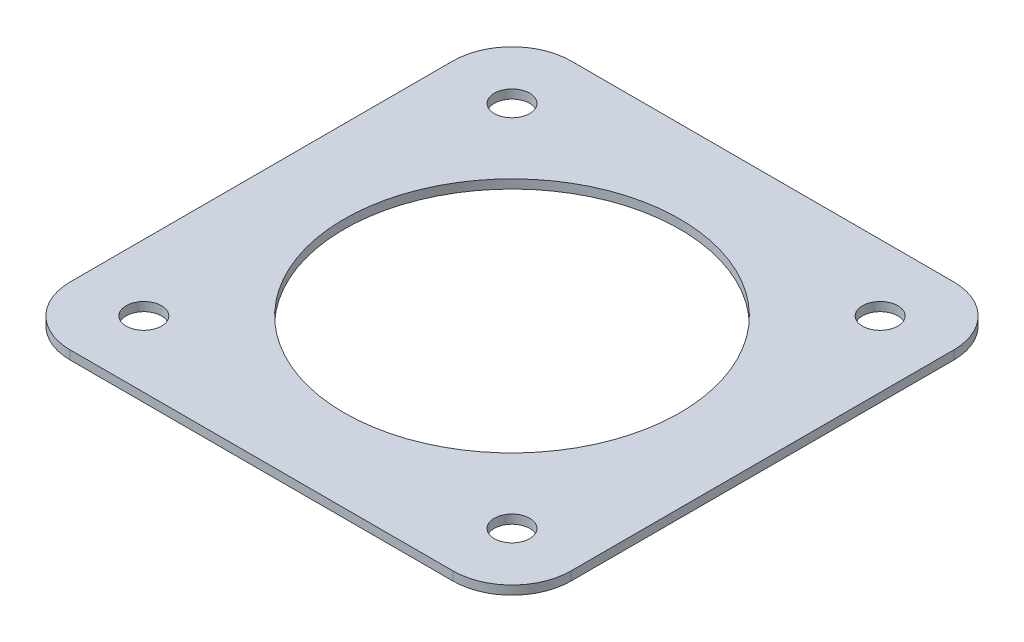
ISO-10303-21;
HEADER;
FILE_DESCRIPTION(('STEP AP214'),'2;1');
FILE_NAME('part.step','',(''),(''),'','','');
FILE_SCHEMA(('AUTOMOTIVE_DESIGN { 1 0 10303 214 1 1 1 1 }'));
ENDSEC;
DATA;
#1=APPLICATION_CONTEXT('core data for automotive mechanical design processes');
#2=APPLICATION_PROTOCOL_DEFINITION('international standard','automotive_design',2000,#1);
#3=PRODUCT_CONTEXT('',#1,'mechanical');
#4=PRODUCT('Part','Part','',(#3));
#5=PRODUCT_RELATED_PRODUCT_CATEGORY('part','',(#4));
#6=PRODUCT_DEFINITION_FORMATION('','',#4);
#7=PRODUCT_DEFINITION_CONTEXT('part definition',#1,'design');
#8=PRODUCT_DEFINITION('design','',#6,#7);
#9=PRODUCT_DEFINITION_SHAPE('','',#8);
#10=(LENGTH_UNIT() NAMED_UNIT(*) SI_UNIT(.MILLI.,.METRE.));
#11=(NAMED_UNIT(*) PLANE_ANGLE_UNIT() SI_UNIT($,.RADIAN.));
#12=(NAMED_UNIT(*) SI_UNIT($,.STERADIAN.) SOLID_ANGLE_UNIT());
#13=UNCERTAINTY_MEASURE_WITH_UNIT(LENGTH_MEASURE(1.E-05),#10,'distance_accuracy_value','');
#14=(GEOMETRIC_REPRESENTATION_CONTEXT(3) GLOBAL_UNCERTAINTY_ASSIGNED_CONTEXT((#13)) GLOBAL_UNIT_ASSIGNED_CONTEXT((#10,
#11,#12)) REPRESENTATION_CONTEXT('',''));
#15=CARTESIAN_POINT('',(0.,0.,0.));
#16=DIRECTION('',(0.,0.,1.));
#17=DIRECTION('',(1.,0.,0.));
#18=AXIS2_PLACEMENT_3D('',#15,#16,#17);
#19=CARTESIAN_POINT('',(-65.,3.,65.));
#20=DIRECTION('',(0.,1.,0.));
#21=DIRECTION('',(0.,0.,1.));
#22=AXIS2_PLACEMENT_3D('',#19,#20,#21);
#23=PLANE('',#22);
#24=CARTESIAN_POINT('',(62.5,3.,-62.5000000000001));
#25=DIRECTION('',(0.,1.,0.));
#26=DIRECTION('',(0.,0.,1.));
#27=AXIS2_PLACEMENT_3D('',#24,#25,#26);
#28=CIRCLE('',#27,6.);
#29=CARTESIAN_POINT('',(62.5,3.,-56.5));
#30=VERTEX_POINT('',#29);
#31=EDGE_CURVE('E196',#30,#30,#28,.T.);
#32=ORIENTED_EDGE('',*,*,#31,.F.);
#33=EDGE_LOOP('',(#32));
#34=FACE_BOUND('',#33,.T.);
#35=CARTESIAN_POINT('',(0.,3.,0.));
#36=DIRECTION('',(0.,1.,0.));
#37=DIRECTION('',(0.,0.,1.));
#38=AXIS2_PLACEMENT_3D('',#35,#36,#37);
#39=CIRCLE('',#38,57.);
#40=CARTESIAN_POINT('',(0.,3.,57.));
#41=VERTEX_POINT('',#40);
#42=EDGE_CURVE('E184',#41,#41,#39,.T.);
#43=ORIENTED_EDGE('',*,*,#42,.F.);
#44=EDGE_LOOP('',(#43));
#45=FACE_BOUND('',#44,.T.);
#46=CARTESIAN_POINT('',(-65.,3.,65.));
#47=DIRECTION('',(0.,1.,0.));
#48=DIRECTION('',(0.,0.,1.));
#49=AXIS2_PLACEMENT_3D('',#46,#47,#48);
#50=CIRCLE('',#49,20.);
#51=CARTESIAN_POINT('',(-85.,3.,64.9999999999999));
#52=VERTEX_POINT('',#51);
#53=CARTESIAN_POINT('',(-64.9999999999998,3.,85.));
#54=VERTEX_POINT('',#53);
#55=EDGE_CURVE('E147',#52,#54,#50,.T.);
#56=ORIENTED_EDGE('',*,*,#55,.T.);
#57=DIRECTION('',(1.,0.,0.));
#58=VECTOR('',#57,1.);
#59=CARTESIAN_POINT('',(64.9999999999999,3.,85.));
#60=LINE('',#59,#58);
#61=CARTESIAN_POINT('',(64.9999999999999,3.,85.));
#62=VERTEX_POINT('',#61);
#63=EDGE_CURVE('E95',#54,#62,#60,.T.);
#64=ORIENTED_EDGE('',*,*,#63,.T.);
#65=CARTESIAN_POINT('',(65.,3.,65.));
#66=DIRECTION('',(0.,1.,0.));
#67=DIRECTION('',(0.,0.,1.));
#68=AXIS2_PLACEMENT_3D('',#65,#66,#67);
#69=CIRCLE('',#68,20.);
#70=CARTESIAN_POINT('',(85.,3.,64.9999999999999));
#71=VERTEX_POINT('',#70);
#72=EDGE_CURVE('E162',#62,#71,#69,.T.);
#73=ORIENTED_EDGE('',*,*,#72,.T.);
#74=DIRECTION('',(0.,0.,-1.));
#75=VECTOR('',#74,1.);
#76=CARTESIAN_POINT('',(85.,3.,64.9999999999999));
#77=LINE('',#76,#75);
#78=CARTESIAN_POINT('',(85.,3.,-64.9999999999999));
#79=VERTEX_POINT('',#78);
#80=EDGE_CURVE('E175',#71,#79,#77,.T.);
#81=ORIENTED_EDGE('',*,*,#80,.T.);
#82=CARTESIAN_POINT('',(65.,3.,-65.));
#83=DIRECTION('',(0.,1.,0.));
#84=DIRECTION('',(0.,0.,1.));
#85=AXIS2_PLACEMENT_3D('',#82,#83,#84);
#86=CIRCLE('',#85,20.);
#87=CARTESIAN_POINT('',(64.9999999999999,3.,-85.));
#88=VERTEX_POINT('',#87);
#89=EDGE_CURVE('E114',#79,#88,#86,.T.);
#90=ORIENTED_EDGE('',*,*,#89,.T.);
#91=DIRECTION('',(-1.,0.,0.));
#92=VECTOR('',#91,1.);
#93=CARTESIAN_POINT('',(64.9999999999999,3.,-85.));
#94=LINE('',#93,#92);
#95=CARTESIAN_POINT('',(-64.9999999999998,3.,-85.));
#96=VERTEX_POINT('',#95);
#97=EDGE_CURVE('E108',#88,#96,#94,.T.);
#98=ORIENTED_EDGE('',*,*,#97,.T.);
#99=CARTESIAN_POINT('',(-65.,3.,-65.));
#100=DIRECTION('',(0.,1.,0.));
#101=DIRECTION('',(0.,0.,1.));
#102=AXIS2_PLACEMENT_3D('',#99,#100,#101);
#103=CIRCLE('',#102,20.);
#104=CARTESIAN_POINT('',(-85.,3.,-64.9999999999998));
#105=VERTEX_POINT('',#104);
#106=EDGE_CURVE('E112',#96,#105,#103,.T.);
#107=ORIENTED_EDGE('',*,*,#106,.T.);
#108=DIRECTION('',(0.,0.,1.));
#109=VECTOR('',#108,1.);
#110=CARTESIAN_POINT('',(-85.,3.,64.9999999999999));
#111=LINE('',#110,#109);
#112=EDGE_CURVE('E52',#105,#52,#111,.T.);
#113=ORIENTED_EDGE('',*,*,#112,.T.);
#114=EDGE_LOOP('',(#56,#64,#73,#81,#90,#98,#107,#113));
#115=FACE_BOUND('',#114,.T.);
#116=CARTESIAN_POINT('',(-62.5,3.,62.5));
#117=DIRECTION('',(0.,1.,0.));
#118=DIRECTION('',(0.,0.,1.));
#119=AXIS2_PLACEMENT_3D('',#116,#117,#118);
#120=CIRCLE('',#119,5.99999999999999);
#121=CARTESIAN_POINT('',(-62.5,3.,68.5));
#122=VERTEX_POINT('',#121);
#123=EDGE_CURVE('E136',#122,#122,#120,.T.);
#124=ORIENTED_EDGE('',*,*,#123,.F.);
#125=EDGE_LOOP('',(#124));
#126=FACE_BOUND('',#125,.T.);
#127=CARTESIAN_POINT('',(-62.5,3.,-62.5));
#128=DIRECTION('',(0.,1.,0.));
#129=DIRECTION('',(0.,0.,1.));
#130=AXIS2_PLACEMENT_3D('',#127,#128,#129);
#131=CIRCLE('',#130,5.99999999999999);
#132=CARTESIAN_POINT('',(-62.5,3.,-56.5));
#133=VERTEX_POINT('',#132);
#134=EDGE_CURVE('E190',#133,#133,#131,.T.);
#135=ORIENTED_EDGE('',*,*,#134,.F.);
#136=EDGE_LOOP('',(#135));
#137=FACE_BOUND('',#136,.T.);
#138=CARTESIAN_POINT('',(62.5,3.,62.5));
#139=DIRECTION('',(0.,1.,0.));
#140=DIRECTION('',(0.,0.,1.));
#141=AXIS2_PLACEMENT_3D('',#138,#139,#140);
#142=CIRCLE('',#141,6.);
#143=CARTESIAN_POINT('',(62.5,3.,68.5));
#144=VERTEX_POINT('',#143);
#145=EDGE_CURVE('E202',#144,#144,#142,.T.);
#146=ORIENTED_EDGE('',*,*,#145,.F.);
#147=EDGE_LOOP('',(#146));
#148=FACE_BOUND('',#147,.T.);
#149=ADVANCED_FACE('F35',(#34,#45,#115,#126,#137,#148),#23,.T.);
#150=CARTESIAN_POINT('',(-65.,0.,65.));
#151=DIRECTION('',(0.,1.,0.));
#152=DIRECTION('',(0.,0.,1.));
#153=AXIS2_PLACEMENT_3D('',#150,#151,#152);
#154=PLANE('',#153);
#155=CARTESIAN_POINT('',(-65.,0.,65.));
#156=DIRECTION('',(0.,1.,0.));
#157=DIRECTION('',(0.,0.,1.));
#158=AXIS2_PLACEMENT_3D('',#155,#156,#157);
#159=CIRCLE('',#158,20.);
#160=CARTESIAN_POINT('',(-85.,0.,64.9999999999999));
#161=VERTEX_POINT('',#160);
#162=CARTESIAN_POINT('',(-64.9999999999998,0.,85.));
#163=VERTEX_POINT('',#162);
#164=EDGE_CURVE('E132',#161,#163,#159,.T.);
#165=ORIENTED_EDGE('',*,*,#164,.F.);
#166=DIRECTION('',(0.,0.,1.));
#167=VECTOR('',#166,1.);
#168=CARTESIAN_POINT('',(-85.,0.,64.9999999999999));
#169=LINE('',#168,#167);
#170=CARTESIAN_POINT('',(-85.,0.,-64.9999999999998));
#171=VERTEX_POINT('',#170);
#172=EDGE_CURVE('E87',#171,#161,#169,.T.);
#173=ORIENTED_EDGE('',*,*,#172,.F.);
#174=CARTESIAN_POINT('',(-65.,0.,-65.));
#175=DIRECTION('',(0.,1.,0.));
#176=DIRECTION('',(0.,0.,1.));
#177=AXIS2_PLACEMENT_3D('',#174,#175,#176);
#178=CIRCLE('',#177,20.);
#179=CARTESIAN_POINT('',(-64.9999999999998,0.,-85.));
#180=VERTEX_POINT('',#179);
#181=EDGE_CURVE('E81',#180,#171,#178,.T.);
#182=ORIENTED_EDGE('',*,*,#181,.F.);
#183=DIRECTION('',(-1.,0.,0.));
#184=VECTOR('',#183,1.);
#185=CARTESIAN_POINT('',(64.9999999999999,0.,-85.));
#186=LINE('',#185,#184);
#187=CARTESIAN_POINT('',(64.9999999999999,0.,-85.));
#188=VERTEX_POINT('',#187);
#189=EDGE_CURVE('E122',#188,#180,#186,.T.);
#190=ORIENTED_EDGE('',*,*,#189,.F.);
#191=CARTESIAN_POINT('',(65.,0.,-65.));
#192=DIRECTION('',(0.,1.,0.));
#193=DIRECTION('',(0.,0.,1.));
#194=AXIS2_PLACEMENT_3D('',#191,#192,#193);
#195=CIRCLE('',#194,20.);
#196=CARTESIAN_POINT('',(85.,0.,-64.9999999999999));
#197=VERTEX_POINT('',#196);
#198=EDGE_CURVE('E142',#197,#188,#195,.T.);
#199=ORIENTED_EDGE('',*,*,#198,.F.);
#200=DIRECTION('',(0.,0.,-1.));
#201=VECTOR('',#200,1.);
#202=CARTESIAN_POINT('',(85.,0.,64.9999999999999));
#203=LINE('',#202,#201);
#204=CARTESIAN_POINT('',(85.,0.,64.9999999999999));
#205=VERTEX_POINT('',#204);
#206=EDGE_CURVE('E140',#205,#197,#203,.T.);
#207=ORIENTED_EDGE('',*,*,#206,.F.);
#208=CARTESIAN_POINT('',(65.,0.,65.));
#209=DIRECTION('',(0.,1.,0.));
#210=DIRECTION('',(0.,0.,1.));
#211=AXIS2_PLACEMENT_3D('',#208,#209,#210);
#212=CIRCLE('',#211,20.);
#213=CARTESIAN_POINT('',(64.9999999999999,0.,85.));
#214=VERTEX_POINT('',#213);
#215=EDGE_CURVE('E138',#214,#205,#212,.T.);
#216=ORIENTED_EDGE('',*,*,#215,.F.);
#217=DIRECTION('',(1.,0.,0.));
#218=VECTOR('',#217,1.);
#219=CARTESIAN_POINT('',(64.9999999999999,0.,85.));
#220=LINE('',#219,#218);
#221=EDGE_CURVE('E135',#163,#214,#220,.T.);
#222=ORIENTED_EDGE('',*,*,#221,.F.);
#223=EDGE_LOOP('',(#165,#173,#182,#190,#199,#207,#216,#222));
#224=FACE_BOUND('',#223,.T.);
#225=CARTESIAN_POINT('',(-62.5,0.,62.5));
#226=DIRECTION('',(0.,1.,0.));
#227=DIRECTION('',(0.,0.,1.));
#228=AXIS2_PLACEMENT_3D('',#225,#226,#227);
#229=CIRCLE('',#228,5.99999999999999);
#230=CARTESIAN_POINT('',(-62.5,0.,68.5));
#231=VERTEX_POINT('',#230);
#232=EDGE_CURVE('E181',#231,#231,#229,.T.);
#233=ORIENTED_EDGE('',*,*,#232,.T.);
#234=EDGE_LOOP('',(#233));
#235=FACE_BOUND('',#234,.T.);
#236=CARTESIAN_POINT('',(0.,0.,0.));
#237=DIRECTION('',(0.,1.,0.));
#238=DIRECTION('',(0.,0.,1.));
#239=AXIS2_PLACEMENT_3D('',#236,#237,#238);
#240=CIRCLE('',#239,57.);
#241=CARTESIAN_POINT('',(0.,0.,57.));
#242=VERTEX_POINT('',#241);
#243=EDGE_CURVE('E187',#242,#242,#240,.T.);
#244=ORIENTED_EDGE('',*,*,#243,.T.);
#245=EDGE_LOOP('',(#244));
#246=FACE_BOUND('',#245,.T.);
#247=CARTESIAN_POINT('',(-62.5,0.,-62.5));
#248=DIRECTION('',(0.,1.,0.));
#249=DIRECTION('',(0.,0.,1.));
#250=AXIS2_PLACEMENT_3D('',#247,#248,#249);
#251=CIRCLE('',#250,5.99999999999999);
#252=CARTESIAN_POINT('',(-62.5,0.,-56.5));
#253=VERTEX_POINT('',#252);
#254=EDGE_CURVE('E193',#253,#253,#251,.T.);
#255=ORIENTED_EDGE('',*,*,#254,.T.);
#256=EDGE_LOOP('',(#255));
#257=FACE_BOUND('',#256,.T.);
#258=CARTESIAN_POINT('',(62.5,0.,-62.5000000000001));
#259=DIRECTION('',(0.,1.,0.));
#260=DIRECTION('',(0.,0.,1.));
#261=AXIS2_PLACEMENT_3D('',#258,#259,#260);
#262=CIRCLE('',#261,6.);
#263=CARTESIAN_POINT('',(62.5,0.,-56.5));
#264=VERTEX_POINT('',#263);
#265=EDGE_CURVE('E199',#264,#264,#262,.T.);
#266=ORIENTED_EDGE('',*,*,#265,.T.);
#267=EDGE_LOOP('',(#266));
#268=FACE_BOUND('',#267,.T.);
#269=CARTESIAN_POINT('',(62.5,0.,62.5));
#270=DIRECTION('',(0.,1.,0.));
#271=DIRECTION('',(0.,0.,1.));
#272=AXIS2_PLACEMENT_3D('',#269,#270,#271);
#273=CIRCLE('',#272,6.);
#274=CARTESIAN_POINT('',(62.5,0.,68.5));
#275=VERTEX_POINT('',#274);
#276=EDGE_CURVE('E205',#275,#275,#273,.T.);
#277=ORIENTED_EDGE('',*,*,#276,.T.);
#278=EDGE_LOOP('',(#277));
#279=FACE_BOUND('',#278,.T.);
#280=ADVANCED_FACE('F166',(#224,#235,#246,#257,#268,#279),#154,.F.);
#281=CARTESIAN_POINT('',(-65.,3.,65.));
#282=DIRECTION('',(0.,-1.,0.));
#283=DIRECTION('',(0.,0.,-1.));
#284=AXIS2_PLACEMENT_3D('',#281,#282,#283);
#285=CYLINDRICAL_SURFACE('',#284,20.);
#286=ORIENTED_EDGE('',*,*,#164,.T.);
#287=DIRECTION('',(0.,-1.,0.));
#288=VECTOR('',#287,1.);
#289=CARTESIAN_POINT('',(-64.9999999999998,3.,85.));
#290=LINE('',#289,#288);
#291=EDGE_CURVE('E11',#54,#163,#290,.T.);
#292=ORIENTED_EDGE('',*,*,#291,.F.);
#293=ORIENTED_EDGE('',*,*,#55,.F.);
#294=DIRECTION('',(0.,-1.,0.));
#295=VECTOR('',#294,1.);
#296=CARTESIAN_POINT('',(-85.,3.,64.9999999999999));
#297=LINE('',#296,#295);
#298=EDGE_CURVE('E128',#52,#161,#297,.T.);
#299=ORIENTED_EDGE('',*,*,#298,.T.);
#300=EDGE_LOOP('',(#286,#292,#293,#299));
#301=FACE_BOUND('',#300,.T.);
#302=ADVANCED_FACE('F37',(#301),#285,.T.);
#303=CARTESIAN_POINT('',(64.9999999999999,3.,85.));
#304=DIRECTION('',(0.,0.,-1.));
#305=DIRECTION('',(-1.,0.,0.));
#306=AXIS2_PLACEMENT_3D('',#303,#304,#305);
#307=PLANE('',#306);
#308=ORIENTED_EDGE('',*,*,#221,.T.);
#309=DIRECTION('',(0.,-1.,0.));
#310=VECTOR('',#309,1.);
#311=CARTESIAN_POINT('',(64.9999999999999,3.,85.));
#312=LINE('',#311,#310);
#313=EDGE_CURVE('E44',#62,#214,#312,.T.);
#314=ORIENTED_EDGE('',*,*,#313,.F.);
#315=ORIENTED_EDGE('',*,*,#63,.F.);
#316=ORIENTED_EDGE('',*,*,#291,.T.);
#317=EDGE_LOOP('',(#308,#314,#315,#316));
#318=FACE_BOUND('',#317,.T.);
#319=ADVANCED_FACE('F239',(#318),#307,.F.);
#320=CARTESIAN_POINT('',(65.,3.,65.));
#321=DIRECTION('',(0.,-1.,0.));
#322=DIRECTION('',(0.,0.,-1.));
#323=AXIS2_PLACEMENT_3D('',#320,#321,#322);
#324=CYLINDRICAL_SURFACE('',#323,20.);
#325=ORIENTED_EDGE('',*,*,#215,.T.);
#326=DIRECTION('',(0.,-1.,0.));
#327=VECTOR('',#326,1.);
#328=CARTESIAN_POINT('',(85.,3.,64.9999999999999));
#329=LINE('',#328,#327);
#330=EDGE_CURVE('E154',#71,#205,#329,.T.);
#331=ORIENTED_EDGE('',*,*,#330,.F.);
#332=ORIENTED_EDGE('',*,*,#72,.F.);
#333=ORIENTED_EDGE('',*,*,#313,.T.);
#334=EDGE_LOOP('',(#325,#331,#332,#333));
#335=FACE_BOUND('',#334,.T.);
#336=ADVANCED_FACE('F160',(#335),#324,.T.);
#337=CARTESIAN_POINT('',(85.,3.,64.9999999999999));
#338=DIRECTION('',(-1.,0.,0.));
#339=DIRECTION('',(0.,0.,1.));
#340=AXIS2_PLACEMENT_3D('',#337,#338,#339);
#341=PLANE('',#340);
#342=ORIENTED_EDGE('',*,*,#206,.T.);
#343=DIRECTION('',(0.,-1.,0.));
#344=VECTOR('',#343,1.);
#345=CARTESIAN_POINT('',(85.,3.,-64.9999999999999));
#346=LINE('',#345,#344);
#347=EDGE_CURVE('E151',#79,#197,#346,.T.);
#348=ORIENTED_EDGE('',*,*,#347,.F.);
#349=ORIENTED_EDGE('',*,*,#80,.F.);
#350=ORIENTED_EDGE('',*,*,#330,.T.);
#351=EDGE_LOOP('',(#342,#348,#349,#350));
#352=FACE_BOUND('',#351,.T.);
#353=ADVANCED_FACE('F171',(#352),#341,.F.);
#354=CARTESIAN_POINT('',(65.,3.,-65.));
#355=DIRECTION('',(0.,-1.,0.));
#356=DIRECTION('',(0.,0.,-1.));
#357=AXIS2_PLACEMENT_3D('',#354,#355,#356);
#358=CYLINDRICAL_SURFACE('',#357,20.);
#359=ORIENTED_EDGE('',*,*,#198,.T.);
#360=DIRECTION('',(0.,-1.,0.));
#361=VECTOR('',#360,1.);
#362=CARTESIAN_POINT('',(64.9999999999999,3.,-85.));
#363=LINE('',#362,#361);
#364=EDGE_CURVE('E123',#88,#188,#363,.T.);
#365=ORIENTED_EDGE('',*,*,#364,.F.);
#366=ORIENTED_EDGE('',*,*,#89,.F.);
#367=ORIENTED_EDGE('',*,*,#347,.T.);
#368=EDGE_LOOP('',(#359,#365,#366,#367));
#369=FACE_BOUND('',#368,.T.);
#370=ADVANCED_FACE('F174',(#369),#358,.T.);
#371=CARTESIAN_POINT('',(64.9999999999999,3.,-85.));
#372=DIRECTION('',(0.,0.,1.));
#373=DIRECTION('',(1.,0.,0.));
#374=AXIS2_PLACEMENT_3D('',#371,#372,#373);
#375=PLANE('',#374);
#376=ORIENTED_EDGE('',*,*,#189,.T.);
#377=DIRECTION('',(0.,-1.,0.));
#378=VECTOR('',#377,1.);
#379=CARTESIAN_POINT('',(-64.9999999999998,3.,-85.));
#380=LINE('',#379,#378);
#381=EDGE_CURVE('E119',#96,#180,#380,.T.);
#382=ORIENTED_EDGE('',*,*,#381,.F.);
#383=ORIENTED_EDGE('',*,*,#97,.F.);
#384=ORIENTED_EDGE('',*,*,#364,.T.);
#385=EDGE_LOOP('',(#376,#382,#383,#384));
#386=FACE_BOUND('',#385,.T.);
#387=ADVANCED_FACE('F120',(#386),#375,.F.);
#388=CARTESIAN_POINT('',(-65.,3.,-65.));
#389=DIRECTION('',(0.,-1.,0.));
#390=DIRECTION('',(0.,0.,-1.));
#391=AXIS2_PLACEMENT_3D('',#388,#389,#390);
#392=CYLINDRICAL_SURFACE('',#391,20.);
#393=ORIENTED_EDGE('',*,*,#181,.T.);
#394=DIRECTION('',(0.,-1.,0.));
#395=VECTOR('',#394,1.);
#396=CARTESIAN_POINT('',(-85.,3.,-64.9999999999998));
#397=LINE('',#396,#395);
#398=EDGE_CURVE('E124',#105,#171,#397,.T.);
#399=ORIENTED_EDGE('',*,*,#398,.F.);
#400=ORIENTED_EDGE('',*,*,#106,.F.);
#401=ORIENTED_EDGE('',*,*,#381,.T.);
#402=EDGE_LOOP('',(#393,#399,#400,#401));
#403=FACE_BOUND('',#402,.T.);
#404=ADVANCED_FACE('F126',(#403),#392,.T.);
#405=CARTESIAN_POINT('',(-85.,3.,64.9999999999999));
#406=DIRECTION('',(1.,0.,0.));
#407=DIRECTION('',(0.,0.,-1.));
#408=AXIS2_PLACEMENT_3D('',#405,#406,#407);
#409=PLANE('',#408);
#410=ORIENTED_EDGE('',*,*,#172,.T.);
#411=ORIENTED_EDGE('',*,*,#298,.F.);
#412=ORIENTED_EDGE('',*,*,#112,.F.);
#413=ORIENTED_EDGE('',*,*,#398,.T.);
#414=EDGE_LOOP('',(#410,#411,#412,#413));
#415=FACE_BOUND('',#414,.T.);
#416=ADVANCED_FACE('F227',(#415),#409,.F.);
#417=CARTESIAN_POINT('',(-62.5,3.,62.5));
#418=DIRECTION('',(0.,-1.,0.));
#419=DIRECTION('',(0.,0.,-1.));
#420=AXIS2_PLACEMENT_3D('',#417,#418,#419);
#421=CYLINDRICAL_SURFACE('',#420,5.99999999999999);
#422=ORIENTED_EDGE('',*,*,#123,.T.);
#423=EDGE_LOOP('',(#422));
#424=FACE_BOUND('',#423,.T.);
#425=ORIENTED_EDGE('',*,*,#232,.F.);
#426=EDGE_LOOP('',(#425));
#427=FACE_BOUND('',#426,.T.);
#428=ADVANCED_FACE('F224',(#424,#427),#421,.F.);
#429=CARTESIAN_POINT('',(0.,3.,0.));
#430=DIRECTION('',(0.,-1.,0.));
#431=DIRECTION('',(0.,0.,-1.));
#432=AXIS2_PLACEMENT_3D('',#429,#430,#431);
#433=CYLINDRICAL_SURFACE('',#432,57.);
#434=ORIENTED_EDGE('',*,*,#42,.T.);
#435=EDGE_LOOP('',(#434));
#436=FACE_BOUND('',#435,.T.);
#437=ORIENTED_EDGE('',*,*,#243,.F.);
#438=EDGE_LOOP('',(#437));
#439=FACE_BOUND('',#438,.T.);
#440=ADVANCED_FACE('F303',(#436,#439),#433,.F.);
#441=CARTESIAN_POINT('',(-62.5,3.,-62.5));
#442=DIRECTION('',(0.,-1.,0.));
#443=DIRECTION('',(0.,0.,-1.));
#444=AXIS2_PLACEMENT_3D('',#441,#442,#443);
#445=CYLINDRICAL_SURFACE('',#444,5.99999999999999);
#446=ORIENTED_EDGE('',*,*,#134,.T.);
#447=EDGE_LOOP('',(#446));
#448=FACE_BOUND('',#447,.T.);
#449=ORIENTED_EDGE('',*,*,#254,.F.);
#450=EDGE_LOOP('',(#449));
#451=FACE_BOUND('',#450,.T.);
#452=ADVANCED_FACE('F311',(#448,#451),#445,.F.);
#453=CARTESIAN_POINT('',(62.5,3.,-62.5000000000001));
#454=DIRECTION('',(0.,-1.,0.));
#455=DIRECTION('',(0.,0.,-1.));
#456=AXIS2_PLACEMENT_3D('',#453,#454,#455);
#457=CYLINDRICAL_SURFACE('',#456,6.);
#458=ORIENTED_EDGE('',*,*,#31,.T.);
#459=EDGE_LOOP('',(#458));
#460=FACE_BOUND('',#459,.T.);
#461=ORIENTED_EDGE('',*,*,#265,.F.);
#462=EDGE_LOOP('',(#461));
#463=FACE_BOUND('',#462,.T.);
#464=ADVANCED_FACE('F319',(#460,#463),#457,.F.);
#465=CARTESIAN_POINT('',(62.5,3.,62.5));
#466=DIRECTION('',(0.,-1.,0.));
#467=DIRECTION('',(0.,0.,-1.));
#468=AXIS2_PLACEMENT_3D('',#465,#466,#467);
#469=CYLINDRICAL_SURFACE('',#468,6.);
#470=ORIENTED_EDGE('',*,*,#145,.T.);
#471=EDGE_LOOP('',(#470));
#472=FACE_BOUND('',#471,.T.);
#473=ORIENTED_EDGE('',*,*,#276,.F.);
#474=EDGE_LOOP('',(#473));
#475=FACE_BOUND('',#474,.T.);
#476=ADVANCED_FACE('F211',(#472,#475),#469,.F.);
#477=CLOSED_SHELL('',(#149,#280,#302,#319,#336,#353,#370,#387,#404,#416,#428,#440,#452,#464,#476));
#478=MANIFOLD_SOLID_BREP('B2',#477);
#479=ADVANCED_BREP_SHAPE_REPRESENTATION('',(#18,#478),#14);
#480=SHAPE_DEFINITION_REPRESENTATION(#9,#479);
ENDSEC;
END-ISO-10303-21;
